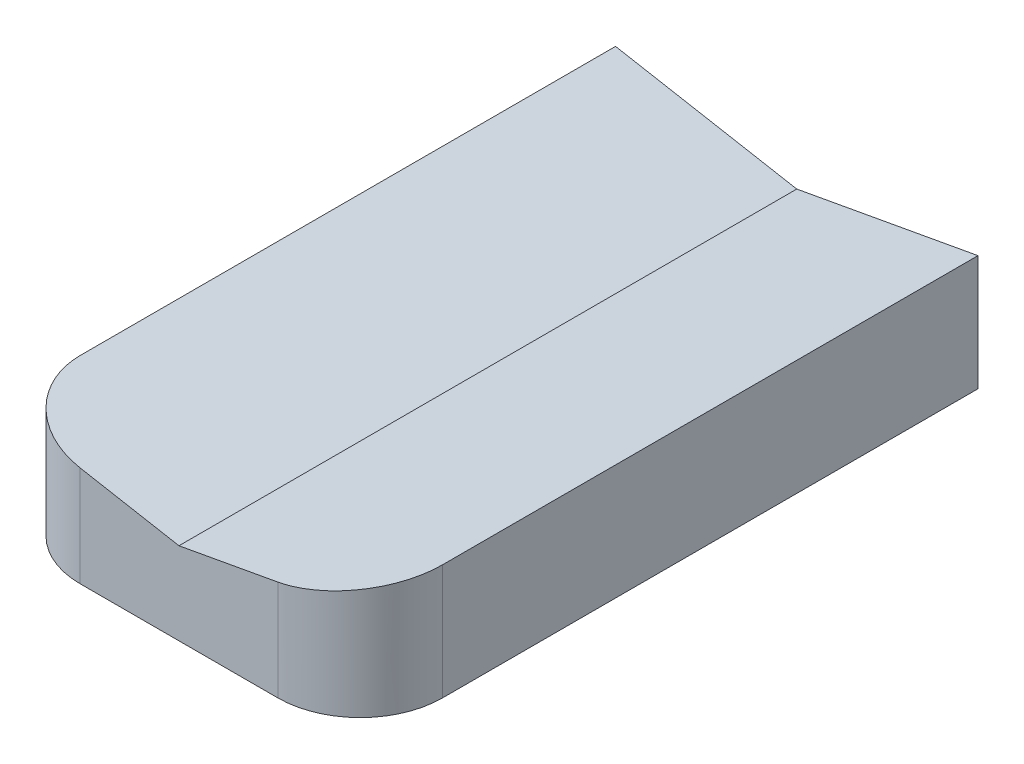
ISO-10303-21;
HEADER;
FILE_DESCRIPTION(('STEP AP214'),'2;1');
FILE_NAME('part.step','',(''),(''),'','','');
FILE_SCHEMA(('AUTOMOTIVE_DESIGN { 1 0 10303 214 1 1 1 1 }'));
ENDSEC;
DATA;
#1=APPLICATION_CONTEXT('core data for automotive mechanical design processes');
#2=APPLICATION_PROTOCOL_DEFINITION('international standard','automotive_design',2000,#1);
#3=PRODUCT_CONTEXT('',#1,'mechanical');
#4=PRODUCT('Part','Part','',(#3));
#5=PRODUCT_RELATED_PRODUCT_CATEGORY('part','',(#4));
#6=PRODUCT_DEFINITION_FORMATION('','',#4);
#7=PRODUCT_DEFINITION_CONTEXT('part definition',#1,'design');
#8=PRODUCT_DEFINITION('design','',#6,#7);
#9=PRODUCT_DEFINITION_SHAPE('','',#8);
#10=(LENGTH_UNIT() NAMED_UNIT(*) SI_UNIT(.MILLI.,.METRE.));
#11=(NAMED_UNIT(*) PLANE_ANGLE_UNIT() SI_UNIT($,.RADIAN.));
#12=(NAMED_UNIT(*) SI_UNIT($,.STERADIAN.) SOLID_ANGLE_UNIT());
#13=UNCERTAINTY_MEASURE_WITH_UNIT(LENGTH_MEASURE(1.E-05),#10,'distance_accuracy_value','');
#14=(GEOMETRIC_REPRESENTATION_CONTEXT(3) GLOBAL_UNCERTAINTY_ASSIGNED_CONTEXT((#13)) GLOBAL_UNIT_ASSIGNED_CONTEXT((#10,
#11,#12)) REPRESENTATION_CONTEXT('',''));
#15=CARTESIAN_POINT('',(0.,0.,0.));
#16=DIRECTION('',(0.,0.,1.));
#17=DIRECTION('',(1.,0.,0.));
#18=AXIS2_PLACEMENT_3D('',#15,#16,#17);
#19=CARTESIAN_POINT('',(-11.,-7.,0.));
#20=DIRECTION('',(0.,0.,1.));
#21=DIRECTION('',(1.,0.,0.));
#22=AXIS2_PLACEMENT_3D('',#19,#20,#21);
#23=PLANE('',#22);
#24=DIRECTION('',(-0.983869910099908,0.178885438199983,0.));
#25=VECTOR('',#24,1.);
#26=CARTESIAN_POINT('',(-11.,0.,0.));
#27=LINE('',#26,#25);
#28=CARTESIAN_POINT('',(0.,-2.,0.));
#29=VERTEX_POINT('',#28);
#30=CARTESIAN_POINT('',(-11.,0.,0.));
#31=VERTEX_POINT('',#30);
#32=EDGE_CURVE('E114',#29,#31,#27,.T.);
#33=ORIENTED_EDGE('',*,*,#32,.F.);
#34=DIRECTION('',(-0.983869910099908,-0.178885438199983,0.));
#35=VECTOR('',#34,1.);
#36=CARTESIAN_POINT('',(0.,-2.,0.));
#37=LINE('',#36,#35);
#38=CARTESIAN_POINT('',(11.,0.,0.));
#39=VERTEX_POINT('',#38);
#40=EDGE_CURVE('E95',#39,#29,#37,.T.);
#41=ORIENTED_EDGE('',*,*,#40,.F.);
#42=DIRECTION('',(0.,1.,0.));
#43=VECTOR('',#42,1.);
#44=CARTESIAN_POINT('',(11.,-7.,0.));
#45=LINE('',#44,#43);
#46=CARTESIAN_POINT('',(11.,-7.,0.));
#47=VERTEX_POINT('',#46);
#48=EDGE_CURVE('E11',#47,#39,#45,.T.);
#49=ORIENTED_EDGE('',*,*,#48,.F.);
#50=DIRECTION('',(1.,0.,0.));
#51=VECTOR('',#50,1.);
#52=CARTESIAN_POINT('',(-11.,-7.,0.));
#53=LINE('',#52,#51);
#54=CARTESIAN_POINT('',(-11.,-7.,0.));
#55=VERTEX_POINT('',#54);
#56=EDGE_CURVE('E123',#55,#47,#53,.T.);
#57=ORIENTED_EDGE('',*,*,#56,.F.);
#58=DIRECTION('',(0.,1.,0.));
#59=VECTOR('',#58,1.);
#60=CARTESIAN_POINT('',(-11.,-7.,0.));
#61=LINE('',#60,#59);
#62=EDGE_CURVE('E135',#55,#31,#61,.T.);
#63=ORIENTED_EDGE('',*,*,#62,.T.);
#64=EDGE_LOOP('',(#33,#41,#49,#57,#63));
#65=FACE_BOUND('',#64,.T.);
#66=ADVANCED_FACE('F35',(#65),#23,.F.);
#67=CARTESIAN_POINT('',(11.,-7.,0.));
#68=DIRECTION('',(-1.,0.,0.));
#69=DIRECTION('',(0.,0.,1.));
#70=AXIS2_PLACEMENT_3D('',#67,#68,#69);
#71=PLANE('',#70);
#72=DIRECTION('',(0.,0.,1.));
#73=VECTOR('',#72,1.);
#74=CARTESIAN_POINT('',(11.,0.,0.));
#75=LINE('',#74,#73);
#76=CARTESIAN_POINT('',(11.,0.,32.5));
#77=VERTEX_POINT('',#76);
#78=EDGE_CURVE('E122',#39,#77,#75,.T.);
#79=ORIENTED_EDGE('',*,*,#78,.T.);
#80=DIRECTION('',(0.,1.,0.));
#81=VECTOR('',#80,1.);
#82=CARTESIAN_POINT('',(11.,-7.,32.5));
#83=LINE('',#82,#81);
#84=CARTESIAN_POINT('',(11.,-7.,32.5));
#85=VERTEX_POINT('',#84);
#86=EDGE_CURVE('E43',#85,#77,#83,.T.);
#87=ORIENTED_EDGE('',*,*,#86,.F.);
#88=DIRECTION('',(0.,0.,1.));
#89=VECTOR('',#88,1.);
#90=CARTESIAN_POINT('',(11.,-7.,0.));
#91=LINE('',#90,#89);
#92=EDGE_CURVE('E125',#47,#85,#91,.T.);
#93=ORIENTED_EDGE('',*,*,#92,.F.);
#94=ORIENTED_EDGE('',*,*,#48,.T.);
#95=EDGE_LOOP('',(#79,#87,#93,#94));
#96=FACE_BOUND('',#95,.T.);
#97=ADVANCED_FACE('F153',(#96),#71,.F.);
#98=CARTESIAN_POINT('',(6.,-7.,32.5));
#99=DIRECTION('',(0.,1.,0.));
#100=DIRECTION('',(0.,0.,1.));
#101=AXIS2_PLACEMENT_3D('',#98,#99,#100);
#102=CYLINDRICAL_SURFACE('',#101,5.);
#103=ORIENTED_EDGE('',*,*,#86,.T.);
#104=CARTESIAN_POINT('',(6.,-0.909090909090909,32.5));
#105=DIRECTION('',(0.178885438199983,-0.983869910099907,0.));
#106=DIRECTION('',(0.983869910099908,0.178885438199983,0.));
#107=AXIS2_PLACEMENT_3D('',#104,#105,#106);
#108=ELLIPSE('',#107,5.08197267613589,5.);
#109=CARTESIAN_POINT('',(6.00000000000001,-0.909090909090908,37.5));
#110=VERTEX_POINT('',#109);
#111=EDGE_CURVE('E120',#77,#110,#108,.T.);
#112=ORIENTED_EDGE('',*,*,#111,.T.);
#113=DIRECTION('',(0.,1.,0.));
#114=VECTOR('',#113,1.);
#115=CARTESIAN_POINT('',(6.,-7.,37.5));
#116=LINE('',#115,#114);
#117=CARTESIAN_POINT('',(6.,-7.,37.5));
#118=VERTEX_POINT('',#117);
#119=EDGE_CURVE('E113',#118,#110,#116,.T.);
#120=ORIENTED_EDGE('',*,*,#119,.F.);
#121=CARTESIAN_POINT('',(6.,-7.,32.5));
#122=DIRECTION('',(0.,-1.,0.));
#123=DIRECTION('',(0.,0.,-1.));
#124=AXIS2_PLACEMENT_3D('',#121,#122,#123);
#125=CIRCLE('',#124,5.);
#126=EDGE_CURVE('E128',#85,#118,#125,.T.);
#127=ORIENTED_EDGE('',*,*,#126,.F.);
#128=EDGE_LOOP('',(#103,#112,#120,#127));
#129=FACE_BOUND('',#128,.T.);
#130=ADVANCED_FACE('F151',(#129),#102,.T.);
#131=CARTESIAN_POINT('',(6.,-7.,37.5));
#132=DIRECTION('',(0.,0.,-1.));
#133=DIRECTION('',(-1.,0.,0.));
#134=AXIS2_PLACEMENT_3D('',#131,#132,#133);
#135=PLANE('',#134);
#136=ORIENTED_EDGE('',*,*,#119,.T.);
#137=DIRECTION('',(-0.983869910099908,-0.178885438199983,0.));
#138=VECTOR('',#137,1.);
#139=CARTESIAN_POINT('',(0.,-2.,37.5));
#140=LINE('',#139,#138);
#141=CARTESIAN_POINT('',(0.,-2.,37.5));
#142=VERTEX_POINT('',#141);
#143=EDGE_CURVE('E92',#110,#142,#140,.T.);
#144=ORIENTED_EDGE('',*,*,#143,.T.);
#145=DIRECTION('',(-0.983869910099908,0.178885438199983,0.));
#146=VECTOR('',#145,1.);
#147=CARTESIAN_POINT('',(-11.,0.,37.5));
#148=LINE('',#147,#146);
#149=CARTESIAN_POINT('',(-6.,-0.909090909090908,37.5));
#150=VERTEX_POINT('',#149);
#151=EDGE_CURVE('E100',#142,#150,#148,.T.);
#152=ORIENTED_EDGE('',*,*,#151,.T.);
#153=DIRECTION('',(0.,1.,0.));
#154=VECTOR('',#153,1.);
#155=CARTESIAN_POINT('',(-6.,-7.,37.5));
#156=LINE('',#155,#154);
#157=CARTESIAN_POINT('',(-6.,-7.,37.5));
#158=VERTEX_POINT('',#157);
#159=EDGE_CURVE('E145',#158,#150,#156,.T.);
#160=ORIENTED_EDGE('',*,*,#159,.F.);
#161=DIRECTION('',(-1.,0.,0.));
#162=VECTOR('',#161,1.);
#163=CARTESIAN_POINT('',(6.,-7.,37.5));
#164=LINE('',#163,#162);
#165=EDGE_CURVE('E130',#118,#158,#164,.T.);
#166=ORIENTED_EDGE('',*,*,#165,.F.);
#167=EDGE_LOOP('',(#136,#144,#152,#160,#166));
#168=FACE_BOUND('',#167,.T.);
#169=ADVANCED_FACE('F110',(#168),#135,.F.);
#170=CARTESIAN_POINT('',(-6.,-7.,32.5));
#171=DIRECTION('',(0.,1.,0.));
#172=DIRECTION('',(0.,0.,1.));
#173=AXIS2_PLACEMENT_3D('',#170,#171,#172);
#174=CYLINDRICAL_SURFACE('',#173,5.);
#175=ORIENTED_EDGE('',*,*,#159,.T.);
#176=CARTESIAN_POINT('',(-6.,-0.909090909090909,32.5));
#177=DIRECTION('',(-0.178885438199983,-0.983869910099907,0.));
#178=DIRECTION('',(-0.983869910099908,0.178885438199983,0.));
#179=AXIS2_PLACEMENT_3D('',#176,#177,#178);
#180=ELLIPSE('',#179,5.08197267613589,5.);
#181=CARTESIAN_POINT('',(-11.,0.,32.5));
#182=VERTEX_POINT('',#181);
#183=EDGE_CURVE('E99',#150,#182,#180,.T.);
#184=ORIENTED_EDGE('',*,*,#183,.T.);
#185=DIRECTION('',(0.,1.,0.));
#186=VECTOR('',#185,1.);
#187=CARTESIAN_POINT('',(-11.,-7.,32.5));
#188=LINE('',#187,#186);
#189=CARTESIAN_POINT('',(-11.,-7.,32.5));
#190=VERTEX_POINT('',#189);
#191=EDGE_CURVE('E142',#190,#182,#188,.T.);
#192=ORIENTED_EDGE('',*,*,#191,.F.);
#193=CARTESIAN_POINT('',(-6.,-7.,32.5));
#194=DIRECTION('',(0.,-1.,0.));
#195=DIRECTION('',(0.,0.,1.));
#196=AXIS2_PLACEMENT_3D('',#193,#194,#195);
#197=CIRCLE('',#196,5.);
#198=EDGE_CURVE('E132',#158,#190,#197,.T.);
#199=ORIENTED_EDGE('',*,*,#198,.F.);
#200=EDGE_LOOP('',(#175,#184,#192,#199));
#201=FACE_BOUND('',#200,.T.);
#202=ADVANCED_FACE('F162',(#201),#174,.T.);
#203=CARTESIAN_POINT('',(-11.,-7.,32.5));
#204=DIRECTION('',(1.,0.,0.));
#205=DIRECTION('',(0.,0.,-1.));
#206=AXIS2_PLACEMENT_3D('',#203,#204,#205);
#207=PLANE('',#206);
#208=DIRECTION('',(0.,0.,-1.));
#209=VECTOR('',#208,1.);
#210=CARTESIAN_POINT('',(-11.,0.,32.5));
#211=LINE('',#210,#209);
#212=EDGE_CURVE('E126',#182,#31,#211,.T.);
#213=ORIENTED_EDGE('',*,*,#212,.T.);
#214=ORIENTED_EDGE('',*,*,#62,.F.);
#215=DIRECTION('',(0.,0.,-1.));
#216=VECTOR('',#215,1.);
#217=CARTESIAN_POINT('',(-11.,-7.,32.5));
#218=LINE('',#217,#216);
#219=EDGE_CURVE('E50',#190,#55,#218,.T.);
#220=ORIENTED_EDGE('',*,*,#219,.F.);
#221=ORIENTED_EDGE('',*,*,#191,.T.);
#222=EDGE_LOOP('',(#213,#214,#220,#221));
#223=FACE_BOUND('',#222,.T.);
#224=ADVANCED_FACE('F158',(#223),#207,.F.);
#225=CARTESIAN_POINT('',(6.,-7.,32.5));
#226=DIRECTION('',(0.,-1.,0.));
#227=DIRECTION('',(0.,0.,-1.));
#228=AXIS2_PLACEMENT_3D('',#225,#226,#227);
#229=PLANE('',#228);
#230=ORIENTED_EDGE('',*,*,#56,.T.);
#231=ORIENTED_EDGE('',*,*,#92,.T.);
#232=ORIENTED_EDGE('',*,*,#126,.T.);
#233=ORIENTED_EDGE('',*,*,#165,.T.);
#234=ORIENTED_EDGE('',*,*,#198,.T.);
#235=ORIENTED_EDGE('',*,*,#219,.T.);
#236=EDGE_LOOP('',(#230,#231,#232,#233,#234,#235));
#237=FACE_BOUND('',#236,.T.);
#238=ADVANCED_FACE('F163',(#237),#229,.T.);
#239=CARTESIAN_POINT('',(0.,-2.,37.5));
#240=DIRECTION('',(0.178885438199983,-0.983869910099907,0.));
#241=DIRECTION('',(0.983869910099908,0.178885438199983,0.));
#242=AXIS2_PLACEMENT_3D('',#239,#240,#241);
#243=PLANE('',#242);
#244=ORIENTED_EDGE('',*,*,#78,.F.);
#245=ORIENTED_EDGE('',*,*,#40,.T.);
#246=DIRECTION('',(0.,0.,-1.));
#247=VECTOR('',#246,1.);
#248=CARTESIAN_POINT('',(0.,-2.,37.5));
#249=LINE('',#248,#247);
#250=EDGE_CURVE('E88',#142,#29,#249,.T.);
#251=ORIENTED_EDGE('',*,*,#250,.F.);
#252=ORIENTED_EDGE('',*,*,#143,.F.);
#253=ORIENTED_EDGE('',*,*,#111,.F.);
#254=EDGE_LOOP('',(#244,#245,#251,#252,#253));
#255=FACE_BOUND('',#254,.T.);
#256=ADVANCED_FACE('F90',(#255),#243,.F.);
#257=CARTESIAN_POINT('',(-11.,0.,37.5));
#258=DIRECTION('',(-0.178885438199983,-0.983869910099907,0.));
#259=DIRECTION('',(0.983869910099908,-0.178885438199983,0.));
#260=AXIS2_PLACEMENT_3D('',#257,#258,#259);
#261=PLANE('',#260);
#262=ORIENTED_EDGE('',*,*,#151,.F.);
#263=ORIENTED_EDGE('',*,*,#250,.T.);
#264=ORIENTED_EDGE('',*,*,#32,.T.);
#265=ORIENTED_EDGE('',*,*,#212,.F.);
#266=ORIENTED_EDGE('',*,*,#183,.F.);
#267=EDGE_LOOP('',(#262,#263,#264,#265,#266));
#268=FACE_BOUND('',#267,.T.);
#269=ADVANCED_FACE('F103',(#268),#261,.F.);
#270=CLOSED_SHELL('',(#66,#97,#130,#169,#202,#224,#238,#256,#269));
#271=MANIFOLD_SOLID_BREP('B2',#270);
#272=ADVANCED_BREP_SHAPE_REPRESENTATION('',(#18,#271),#14);
#273=SHAPE_DEFINITION_REPRESENTATION(#9,#272);
ENDSEC;
END-ISO-10303-21;
